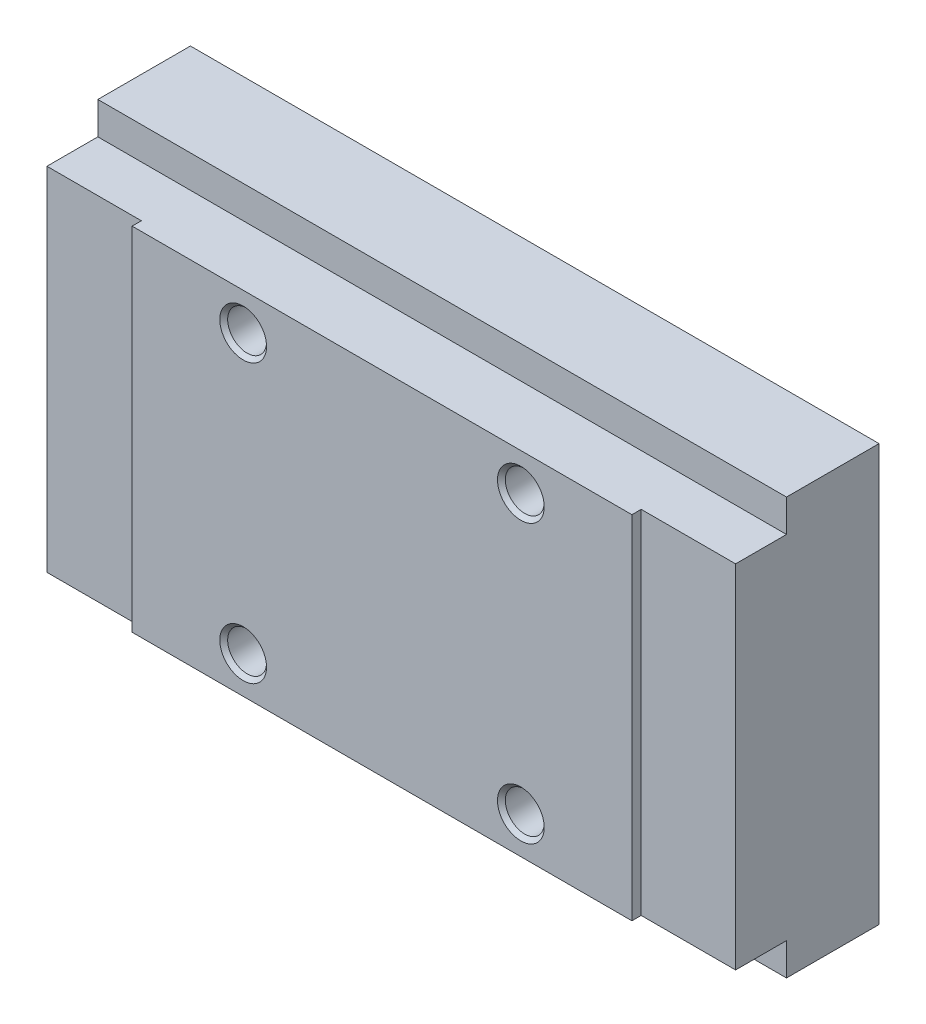
ISO-10303-21;
HEADER;
FILE_DESCRIPTION(('STEP AP214'),'2;1');
FILE_NAME('part.step','',(''),(''),'','','');
FILE_SCHEMA(('AUTOMOTIVE_DESIGN { 1 0 10303 214 1 1 1 1 }'));
ENDSEC;
DATA;
#1=APPLICATION_CONTEXT('core data for automotive mechanical design processes');
#2=APPLICATION_PROTOCOL_DEFINITION('international standard','automotive_design',2000,#1);
#3=PRODUCT_CONTEXT('',#1,'mechanical');
#4=PRODUCT('Part','Part','',(#3));
#5=PRODUCT_RELATED_PRODUCT_CATEGORY('part','',(#4));
#6=PRODUCT_DEFINITION_FORMATION('','',#4);
#7=PRODUCT_DEFINITION_CONTEXT('part definition',#1,'design');
#8=PRODUCT_DEFINITION('design','',#6,#7);
#9=PRODUCT_DEFINITION_SHAPE('','',#8);
#10=(LENGTH_UNIT() NAMED_UNIT(*) SI_UNIT(.MILLI.,.METRE.));
#11=(NAMED_UNIT(*) PLANE_ANGLE_UNIT() SI_UNIT($,.RADIAN.));
#12=(NAMED_UNIT(*) SI_UNIT($,.STERADIAN.) SOLID_ANGLE_UNIT());
#13=UNCERTAINTY_MEASURE_WITH_UNIT(LENGTH_MEASURE(1.E-05),#10,'distance_accuracy_value','');
#14=(GEOMETRIC_REPRESENTATION_CONTEXT(3) GLOBAL_UNCERTAINTY_ASSIGNED_CONTEXT((#13)) GLOBAL_UNIT_ASSIGNED_CONTEXT((#10,
#11,#12)) REPRESENTATION_CONTEXT('',''));
#15=CARTESIAN_POINT('',(0.,0.,0.));
#16=DIRECTION('',(0.,0.,1.));
#17=DIRECTION('',(1.,0.,0.));
#18=AXIS2_PLACEMENT_3D('',#15,#16,#17);
#19=CARTESIAN_POINT('',(0.,0.,10.));
#20=DIRECTION('',(1.,0.,0.));
#21=DIRECTION('',(0.,1.,0.));
#22=AXIS2_PLACEMENT_3D('',#19,#20,#21);
#23=PLANE('',#22);
#24=DIRECTION('',(0.,-1.,0.));
#25=VECTOR('',#24,1.);
#26=CARTESIAN_POINT('',(0.,0.,15.5));
#27=LINE('',#26,#25);
#28=CARTESIAN_POINT('',(0.,-3.5,15.5));
#29=VERTEX_POINT('',#28);
#30=CARTESIAN_POINT('',(0.,-41.5,15.5));
#31=VERTEX_POINT('',#30);
#32=EDGE_CURVE('E148',#29,#31,#27,.T.);
#33=ORIENTED_EDGE('',*,*,#32,.F.);
#34=DIRECTION('',(0.,0.,-1.));
#35=VECTOR('',#34,1.);
#36=CARTESIAN_POINT('',(0.,-3.5,16.5));
#37=LINE('',#36,#35);
#38=CARTESIAN_POINT('',(0.,-3.5,10.));
#39=VERTEX_POINT('',#38);
#40=EDGE_CURVE('E215',#29,#39,#37,.T.);
#41=ORIENTED_EDGE('',*,*,#40,.T.);
#42=DIRECTION('',(0.,-1.,0.));
#43=VECTOR('',#42,1.);
#44=CARTESIAN_POINT('',(0.,0.,10.));
#45=LINE('',#44,#43);
#46=CARTESIAN_POINT('',(0.,0.,10.));
#47=VERTEX_POINT('',#46);
#48=EDGE_CURVE('E228',#47,#39,#45,.T.);
#49=ORIENTED_EDGE('',*,*,#48,.F.);
#50=DIRECTION('',(0.,0.,-1.));
#51=VECTOR('',#50,1.);
#52=CARTESIAN_POINT('',(0.,0.,10.));
#53=LINE('',#52,#51);
#54=CARTESIAN_POINT('',(0.,0.,0.));
#55=VERTEX_POINT('',#54);
#56=EDGE_CURVE('E240',#47,#55,#53,.T.);
#57=ORIENTED_EDGE('',*,*,#56,.T.);
#58=DIRECTION('',(0.,-1.,0.));
#59=VECTOR('',#58,1.);
#60=CARTESIAN_POINT('',(0.,0.,0.));
#61=LINE('',#60,#59);
#62=CARTESIAN_POINT('',(0.,-45.,0.));
#63=VERTEX_POINT('',#62);
#64=EDGE_CURVE('E227',#55,#63,#61,.T.);
#65=ORIENTED_EDGE('',*,*,#64,.T.);
#66=DIRECTION('',(0.,0.,-1.));
#67=VECTOR('',#66,1.);
#68=CARTESIAN_POINT('',(0.,-45.,10.));
#69=LINE('',#68,#67);
#70=CARTESIAN_POINT('',(0.,-45.,10.));
#71=VERTEX_POINT('',#70);
#72=EDGE_CURVE('E256',#71,#63,#69,.T.);
#73=ORIENTED_EDGE('',*,*,#72,.F.);
#74=CARTESIAN_POINT('',(0.,-41.5,10.));
#75=VERTEX_POINT('',#74);
#76=EDGE_CURVE('E232',#75,#71,#45,.T.);
#77=ORIENTED_EDGE('',*,*,#76,.F.);
#78=DIRECTION('',(0.,0.,-1.));
#79=VECTOR('',#78,1.);
#80=CARTESIAN_POINT('',(0.,-41.5,16.5));
#81=LINE('',#80,#79);
#82=EDGE_CURVE('E225',#31,#75,#81,.T.);
#83=ORIENTED_EDGE('',*,*,#82,.F.);
#84=EDGE_LOOP('',(#33,#41,#49,#57,#65,#73,#77,#83));
#85=FACE_BOUND('',#84,.T.);
#86=ADVANCED_FACE('F42',(#85),#23,.F.);
#87=CARTESIAN_POINT('',(74.4,0.,10.));
#88=DIRECTION('',(-1.,0.,0.));
#89=DIRECTION('',(0.,0.,1.));
#90=AXIS2_PLACEMENT_3D('',#87,#88,#89);
#91=PLANE('',#90);
#92=DIRECTION('',(0.,1.,0.));
#93=VECTOR('',#92,1.);
#94=CARTESIAN_POINT('',(74.4,0.,15.5));
#95=LINE('',#94,#93);
#96=CARTESIAN_POINT('',(74.4,-41.5,15.5));
#97=VERTEX_POINT('',#96);
#98=CARTESIAN_POINT('',(74.4,-3.5,15.5));
#99=VERTEX_POINT('',#98);
#100=EDGE_CURVE('E151',#97,#99,#95,.T.);
#101=ORIENTED_EDGE('',*,*,#100,.F.);
#102=DIRECTION('',(0.,0.,-1.));
#103=VECTOR('',#102,1.);
#104=CARTESIAN_POINT('',(74.4,-41.5,16.5));
#105=LINE('',#104,#103);
#106=CARTESIAN_POINT('',(74.4,-41.5,10.));
#107=VERTEX_POINT('',#106);
#108=EDGE_CURVE('E223',#97,#107,#105,.T.);
#109=ORIENTED_EDGE('',*,*,#108,.T.);
#110=DIRECTION('',(0.,1.,0.));
#111=VECTOR('',#110,1.);
#112=CARTESIAN_POINT('',(74.4,0.,10.));
#113=LINE('',#112,#111);
#114=CARTESIAN_POINT('',(74.4,-45.,10.));
#115=VERTEX_POINT('',#114);
#116=EDGE_CURVE('E235',#115,#107,#113,.T.);
#117=ORIENTED_EDGE('',*,*,#116,.F.);
#118=DIRECTION('',(0.,0.,-1.));
#119=VECTOR('',#118,1.);
#120=CARTESIAN_POINT('',(74.4,-45.,10.));
#121=LINE('',#120,#119);
#122=CARTESIAN_POINT('',(74.4,-45.,0.));
#123=VERTEX_POINT('',#122);
#124=EDGE_CURVE('E254',#115,#123,#121,.T.);
#125=ORIENTED_EDGE('',*,*,#124,.T.);
#126=DIRECTION('',(0.,1.,0.));
#127=VECTOR('',#126,1.);
#128=CARTESIAN_POINT('',(74.4,0.,0.));
#129=LINE('',#128,#127);
#130=CARTESIAN_POINT('',(74.4,0.,0.));
#131=VERTEX_POINT('',#130);
#132=EDGE_CURVE('E245',#123,#131,#129,.T.);
#133=ORIENTED_EDGE('',*,*,#132,.T.);
#134=DIRECTION('',(0.,0.,-1.));
#135=VECTOR('',#134,1.);
#136=CARTESIAN_POINT('',(74.4,0.,10.));
#137=LINE('',#136,#135);
#138=CARTESIAN_POINT('',(74.4,0.,10.));
#139=VERTEX_POINT('',#138);
#140=EDGE_CURVE('E251',#139,#131,#137,.T.);
#141=ORIENTED_EDGE('',*,*,#140,.F.);
#142=CARTESIAN_POINT('',(74.4,-3.5,10.));
#143=VERTEX_POINT('',#142);
#144=EDGE_CURVE('E234',#143,#139,#113,.T.);
#145=ORIENTED_EDGE('',*,*,#144,.F.);
#146=DIRECTION('',(0.,0.,-1.));
#147=VECTOR('',#146,1.);
#148=CARTESIAN_POINT('',(74.4,-3.5,16.5));
#149=LINE('',#148,#147);
#150=EDGE_CURVE('E221',#99,#143,#149,.T.);
#151=ORIENTED_EDGE('',*,*,#150,.F.);
#152=EDGE_LOOP('',(#101,#109,#117,#125,#133,#141,#145,#151));
#153=FACE_BOUND('',#152,.T.);
#154=ADVANCED_FACE('F276',(#153),#91,.F.);
#155=CARTESIAN_POINT('',(0.,-41.5,16.5));
#156=DIRECTION('',(0.,1.,0.));
#157=DIRECTION('',(0.,0.,1.));
#158=AXIS2_PLACEMENT_3D('',#155,#156,#157);
#159=PLANE('',#158);
#160=DIRECTION('',(0.,0.,1.));
#161=VECTOR('',#160,1.);
#162=CARTESIAN_POINT('',(10.2,-41.5,15.5));
#163=LINE('',#162,#161);
#164=CARTESIAN_POINT('',(10.2,-41.5,15.5));
#165=VERTEX_POINT('',#164);
#166=CARTESIAN_POINT('',(10.2,-41.5,16.5));
#167=VERTEX_POINT('',#166);
#168=EDGE_CURVE('E64',#165,#167,#163,.T.);
#169=ORIENTED_EDGE('',*,*,#168,.F.);
#170=DIRECTION('',(1.,0.,0.));
#171=VECTOR('',#170,1.);
#172=CARTESIAN_POINT('',(0.,-41.5,15.5));
#173=LINE('',#172,#171);
#174=EDGE_CURVE('E143',#31,#165,#173,.T.);
#175=ORIENTED_EDGE('',*,*,#174,.F.);
#176=ORIENTED_EDGE('',*,*,#82,.T.);
#177=DIRECTION('',(1.,0.,0.));
#178=VECTOR('',#177,1.);
#179=CARTESIAN_POINT('',(0.,-41.5,10.));
#180=LINE('',#179,#178);
#181=EDGE_CURVE('E209',#75,#107,#180,.T.);
#182=ORIENTED_EDGE('',*,*,#181,.T.);
#183=ORIENTED_EDGE('',*,*,#108,.F.);
#184=CARTESIAN_POINT('',(64.2,-41.5,15.5));
#185=VERTEX_POINT('',#184);
#186=EDGE_CURVE('E153',#185,#97,#173,.T.);
#187=ORIENTED_EDGE('',*,*,#186,.F.);
#188=DIRECTION('',(0.,0.,1.));
#189=VECTOR('',#188,1.);
#190=CARTESIAN_POINT('',(64.2,-41.5,15.5));
#191=LINE('',#190,#189);
#192=CARTESIAN_POINT('',(64.2,-41.5,16.5));
#193=VERTEX_POINT('',#192);
#194=EDGE_CURVE('E165',#185,#193,#191,.T.);
#195=ORIENTED_EDGE('',*,*,#194,.T.);
#196=DIRECTION('',(1.,0.,0.));
#197=VECTOR('',#196,1.);
#198=CARTESIAN_POINT('',(0.,-41.5,16.5));
#199=LINE('',#198,#197);
#200=EDGE_CURVE('E164',#167,#193,#199,.T.);
#201=ORIENTED_EDGE('',*,*,#200,.F.);
#202=EDGE_LOOP('',(#169,#175,#176,#182,#183,#187,#195,#201));
#203=FACE_BOUND('',#202,.T.);
#204=ADVANCED_FACE('F161',(#203),#159,.F.);
#205=CARTESIAN_POINT('',(0.,-3.5,16.5));
#206=DIRECTION('',(0.,-1.,0.));
#207=DIRECTION('',(0.,0.,-1.));
#208=AXIS2_PLACEMENT_3D('',#205,#206,#207);
#209=PLANE('',#208);
#210=DIRECTION('',(0.,0.,1.));
#211=VECTOR('',#210,1.);
#212=CARTESIAN_POINT('',(10.2,-3.5,15.5));
#213=LINE('',#212,#211);
#214=CARTESIAN_POINT('',(10.2,-3.5,15.5));
#215=VERTEX_POINT('',#214);
#216=CARTESIAN_POINT('',(10.2,-3.5,16.5));
#217=VERTEX_POINT('',#216);
#218=EDGE_CURVE('E156',#215,#217,#213,.T.);
#219=ORIENTED_EDGE('',*,*,#218,.T.);
#220=DIRECTION('',(-1.,0.,0.));
#221=VECTOR('',#220,1.);
#222=CARTESIAN_POINT('',(0.,-3.5,16.5));
#223=LINE('',#222,#221);
#224=CARTESIAN_POINT('',(64.2,-3.5,16.5));
#225=VERTEX_POINT('',#224);
#226=EDGE_CURVE('E211',#225,#217,#223,.T.);
#227=ORIENTED_EDGE('',*,*,#226,.F.);
#228=DIRECTION('',(0.,0.,1.));
#229=VECTOR('',#228,1.);
#230=CARTESIAN_POINT('',(64.2,-3.5,15.5));
#231=LINE('',#230,#229);
#232=CARTESIAN_POINT('',(64.2,-3.5,15.5));
#233=VERTEX_POINT('',#232);
#234=EDGE_CURVE('E56',#233,#225,#231,.T.);
#235=ORIENTED_EDGE('',*,*,#234,.F.);
#236=DIRECTION('',(-1.,0.,0.));
#237=VECTOR('',#236,1.);
#238=CARTESIAN_POINT('',(0.,-3.5,15.5));
#239=LINE('',#238,#237);
#240=EDGE_CURVE('E12',#99,#233,#239,.T.);
#241=ORIENTED_EDGE('',*,*,#240,.F.);
#242=ORIENTED_EDGE('',*,*,#150,.T.);
#243=DIRECTION('',(-1.,0.,0.));
#244=VECTOR('',#243,1.);
#245=CARTESIAN_POINT('',(0.,-3.5,10.));
#246=LINE('',#245,#244);
#247=EDGE_CURVE('E212',#143,#39,#246,.T.);
#248=ORIENTED_EDGE('',*,*,#247,.T.);
#249=ORIENTED_EDGE('',*,*,#40,.F.);
#250=EDGE_CURVE('E49',#215,#29,#239,.T.);
#251=ORIENTED_EDGE('',*,*,#250,.F.);
#252=EDGE_LOOP('',(#219,#227,#235,#241,#242,#248,#249,#251));
#253=FACE_BOUND('',#252,.T.);
#254=ADVANCED_FACE('F266',(#253),#209,.F.);
#255=CARTESIAN_POINT('',(0.,0.,16.5));
#256=DIRECTION('',(0.,0.,1.));
#257=DIRECTION('',(1.,0.,0.));
#258=AXIS2_PLACEMENT_3D('',#255,#256,#257);
#259=PLANE('',#258);
#260=CARTESIAN_POINT('',(22.2,-7.5,16.5));
#261=DIRECTION('',(0.,0.,1.));
#262=DIRECTION('',(1.,0.,0.));
#263=AXIS2_PLACEMENT_3D('',#260,#261,#262);
#264=CIRCLE('',#263,2.525);
#265=CARTESIAN_POINT('',(24.725,-7.5,16.5));
#266=VERTEX_POINT('',#265);
#267=EDGE_CURVE('E173',#266,#266,#264,.T.);
#268=ORIENTED_EDGE('',*,*,#267,.F.);
#269=EDGE_LOOP('',(#268));
#270=FACE_BOUND('',#269,.T.);
#271=CARTESIAN_POINT('',(52.2,-7.5,16.5));
#272=DIRECTION('',(0.,0.,1.));
#273=DIRECTION('',(1.,0.,0.));
#274=AXIS2_PLACEMENT_3D('',#271,#272,#273);
#275=CIRCLE('',#274,2.525);
#276=CARTESIAN_POINT('',(54.725,-7.5,16.5));
#277=VERTEX_POINT('',#276);
#278=EDGE_CURVE('E182',#277,#277,#275,.T.);
#279=ORIENTED_EDGE('',*,*,#278,.F.);
#280=EDGE_LOOP('',(#279));
#281=FACE_BOUND('',#280,.T.);
#282=CARTESIAN_POINT('',(52.2000000000003,-37.5,16.5));
#283=DIRECTION('',(0.,0.,1.));
#284=DIRECTION('',(1.,0.,0.));
#285=AXIS2_PLACEMENT_3D('',#282,#283,#284);
#286=CIRCLE('',#285,2.525);
#287=CARTESIAN_POINT('',(54.7250000000003,-37.5,16.5));
#288=VERTEX_POINT('',#287);
#289=EDGE_CURVE('E191',#288,#288,#286,.T.);
#290=ORIENTED_EDGE('',*,*,#289,.F.);
#291=EDGE_LOOP('',(#290));
#292=FACE_BOUND('',#291,.T.);
#293=CARTESIAN_POINT('',(22.2000000000003,-37.5,16.5));
#294=DIRECTION('',(0.,0.,1.));
#295=DIRECTION('',(1.,0.,0.));
#296=AXIS2_PLACEMENT_3D('',#293,#294,#295);
#297=CIRCLE('',#296,2.525);
#298=CARTESIAN_POINT('',(24.7250000000003,-37.5,16.5));
#299=VERTEX_POINT('',#298);
#300=EDGE_CURVE('E200',#299,#299,#297,.T.);
#301=ORIENTED_EDGE('',*,*,#300,.F.);
#302=EDGE_LOOP('',(#301));
#303=FACE_BOUND('',#302,.T.);
#304=ORIENTED_EDGE('',*,*,#226,.T.);
#305=DIRECTION('',(0.,-1.,0.));
#306=VECTOR('',#305,1.);
#307=CARTESIAN_POINT('',(10.2,-3.5,16.5));
#308=LINE('',#307,#306);
#309=EDGE_CURVE('E300',#217,#167,#308,.T.);
#310=ORIENTED_EDGE('',*,*,#309,.T.);
#311=ORIENTED_EDGE('',*,*,#200,.T.);
#312=DIRECTION('',(0.,1.,0.));
#313=VECTOR('',#312,1.);
#314=CARTESIAN_POINT('',(64.2,-3.5,16.5));
#315=LINE('',#314,#313);
#316=EDGE_CURVE('E158',#193,#225,#315,.T.);
#317=ORIENTED_EDGE('',*,*,#316,.T.);
#318=EDGE_LOOP('',(#304,#310,#311,#317));
#319=FACE_BOUND('',#318,.T.);
#320=ADVANCED_FACE('F304',(#270,#281,#292,#303,#319),#259,.T.);
#321=CARTESIAN_POINT('',(0.,0.,10.));
#322=DIRECTION('',(0.,0.,1.));
#323=DIRECTION('',(1.,0.,0.));
#324=AXIS2_PLACEMENT_3D('',#321,#322,#323);
#325=PLANE('',#324);
#326=ORIENTED_EDGE('',*,*,#247,.F.);
#327=ORIENTED_EDGE('',*,*,#144,.T.);
#328=DIRECTION('',(-1.,0.,0.));
#329=VECTOR('',#328,1.);
#330=CARTESIAN_POINT('',(0.,0.,10.));
#331=LINE('',#330,#329);
#332=EDGE_CURVE('E238',#139,#47,#331,.T.);
#333=ORIENTED_EDGE('',*,*,#332,.T.);
#334=ORIENTED_EDGE('',*,*,#48,.T.);
#335=EDGE_LOOP('',(#326,#327,#333,#334));
#336=FACE_BOUND('',#335,.T.);
#337=ADVANCED_FACE('F272',(#336),#325,.T.);
#338=CARTESIAN_POINT('',(0.,-45.,10.));
#339=DIRECTION('',(0.,1.,0.));
#340=DIRECTION('',(0.,0.,1.));
#341=AXIS2_PLACEMENT_3D('',#338,#339,#340);
#342=PLANE('',#341);
#343=DIRECTION('',(1.,0.,0.));
#344=VECTOR('',#343,1.);
#345=CARTESIAN_POINT('',(0.,-45.,0.));
#346=LINE('',#345,#344);
#347=EDGE_CURVE('E243',#63,#123,#346,.T.);
#348=ORIENTED_EDGE('',*,*,#347,.T.);
#349=ORIENTED_EDGE('',*,*,#124,.F.);
#350=DIRECTION('',(1.,0.,0.));
#351=VECTOR('',#350,1.);
#352=CARTESIAN_POINT('',(0.,-45.,10.));
#353=LINE('',#352,#351);
#354=EDGE_CURVE('E231',#71,#115,#353,.T.);
#355=ORIENTED_EDGE('',*,*,#354,.F.);
#356=ORIENTED_EDGE('',*,*,#72,.T.);
#357=EDGE_LOOP('',(#348,#349,#355,#356));
#358=FACE_BOUND('',#357,.T.);
#359=ADVANCED_FACE('F287',(#358),#342,.F.);
#360=CARTESIAN_POINT('',(0.,0.,10.));
#361=DIRECTION('',(0.,-1.,0.));
#362=DIRECTION('',(0.,0.,-1.));
#363=AXIS2_PLACEMENT_3D('',#360,#361,#362);
#364=PLANE('',#363);
#365=DIRECTION('',(-1.,0.,0.));
#366=VECTOR('',#365,1.);
#367=CARTESIAN_POINT('',(0.,0.,0.));
#368=LINE('',#367,#366);
#369=EDGE_CURVE('E247',#131,#55,#368,.T.);
#370=ORIENTED_EDGE('',*,*,#369,.T.);
#371=ORIENTED_EDGE('',*,*,#56,.F.);
#372=ORIENTED_EDGE('',*,*,#332,.F.);
#373=ORIENTED_EDGE('',*,*,#140,.T.);
#374=EDGE_LOOP('',(#370,#371,#372,#373));
#375=FACE_BOUND('',#374,.T.);
#376=ADVANCED_FACE('F282',(#375),#364,.F.);
#377=ORIENTED_EDGE('',*,*,#181,.F.);
#378=ORIENTED_EDGE('',*,*,#76,.T.);
#379=ORIENTED_EDGE('',*,*,#354,.T.);
#380=ORIENTED_EDGE('',*,*,#116,.T.);
#381=EDGE_LOOP('',(#377,#378,#379,#380));
#382=FACE_BOUND('',#381,.T.);
#383=ADVANCED_FACE('F292',(#382),#325,.T.);
#384=CARTESIAN_POINT('',(0.,0.,0.));
#385=DIRECTION('',(0.,0.,1.));
#386=DIRECTION('',(1.,0.,0.));
#387=AXIS2_PLACEMENT_3D('',#384,#385,#386);
#388=PLANE('',#387);
#389=ORIENTED_EDGE('',*,*,#64,.F.);
#390=ORIENTED_EDGE('',*,*,#369,.F.);
#391=ORIENTED_EDGE('',*,*,#132,.F.);
#392=ORIENTED_EDGE('',*,*,#347,.F.);
#393=EDGE_LOOP('',(#389,#390,#391,#392));
#394=FACE_BOUND('',#393,.T.);
#395=ADVANCED_FACE('F285',(#394),#388,.F.);
#396=CARTESIAN_POINT('',(22.2000000000003,-37.5,4.1));
#397=DIRECTION('',(0.,0.,1.));
#398=DIRECTION('',(1.,0.,0.));
#399=AXIS2_PLACEMENT_3D('',#396,#397,#398);
#400=CONICAL_SURFACE('',#399,2.1,1.02974425867665);
#401=CARTESIAN_POINT('',(22.2000000000003,-37.5,2.83819270004212));
#402=VERTEX_POINT('',#401);
#403=VERTEX_LOOP('',#402);
#404=FACE_BOUND('',#403,.T.);
#405=CARTESIAN_POINT('',(22.2000000000003,-37.5,4.1));
#406=DIRECTION('',(0.,0.,1.));
#407=DIRECTION('',(1.,0.,0.));
#408=AXIS2_PLACEMENT_3D('',#405,#406,#407);
#409=CIRCLE('',#408,2.1);
#410=CARTESIAN_POINT('',(24.3000000000003,-37.5,4.1));
#411=VERTEX_POINT('',#410);
#412=EDGE_CURVE('E206',#411,#411,#409,.T.);
#413=ORIENTED_EDGE('',*,*,#412,.T.);
#414=EDGE_LOOP('',(#413));
#415=FACE_BOUND('',#414,.T.);
#416=ADVANCED_FACE('F338',(#404,#415),#400,.F.);
#417=CARTESIAN_POINT('',(22.2000000000003,-37.5,16.5));
#418=DIRECTION('',(0.,0.,1.));
#419=DIRECTION('',(1.,0.,0.));
#420=AXIS2_PLACEMENT_3D('',#417,#418,#419);
#421=CYLINDRICAL_SURFACE('',#420,2.1);
#422=ORIENTED_EDGE('',*,*,#412,.F.);
#423=EDGE_LOOP('',(#422));
#424=FACE_BOUND('',#423,.T.);
#425=CARTESIAN_POINT('',(22.2000000000003,-37.5,16.075));
#426=DIRECTION('',(0.,0.,1.));
#427=DIRECTION('',(1.,0.,0.));
#428=AXIS2_PLACEMENT_3D('',#425,#426,#427);
#429=CIRCLE('',#428,2.1);
#430=CARTESIAN_POINT('',(24.3000000000003,-37.5,16.075));
#431=VERTEX_POINT('',#430);
#432=EDGE_CURVE('E203',#431,#431,#429,.T.);
#433=ORIENTED_EDGE('',*,*,#432,.T.);
#434=EDGE_LOOP('',(#433));
#435=FACE_BOUND('',#434,.T.);
#436=ADVANCED_FACE('F342',(#424,#435),#421,.F.);
#437=CARTESIAN_POINT('',(22.2000000000003,-37.5,16.5));
#438=DIRECTION('',(0.,0.,1.));
#439=DIRECTION('',(1.,0.,0.));
#440=AXIS2_PLACEMENT_3D('',#437,#438,#439);
#441=CONICAL_SURFACE('',#440,2.525,0.785398163397448);
#442=ORIENTED_EDGE('',*,*,#432,.F.);
#443=EDGE_LOOP('',(#442));
#444=FACE_BOUND('',#443,.T.);
#445=ORIENTED_EDGE('',*,*,#300,.T.);
#446=EDGE_LOOP('',(#445));
#447=FACE_BOUND('',#446,.T.);
#448=ADVANCED_FACE('F347',(#444,#447),#441,.F.);
#449=CARTESIAN_POINT('',(52.2000000000003,-37.5,4.1));
#450=DIRECTION('',(0.,0.,1.));
#451=DIRECTION('',(1.,0.,0.));
#452=AXIS2_PLACEMENT_3D('',#449,#450,#451);
#453=CONICAL_SURFACE('',#452,2.1,1.02974425867665);
#454=CARTESIAN_POINT('',(52.2000000000003,-37.5,2.83819270004212));
#455=VERTEX_POINT('',#454);
#456=VERTEX_LOOP('',#455);
#457=FACE_BOUND('',#456,.T.);
#458=CARTESIAN_POINT('',(52.2000000000003,-37.5,4.1));
#459=DIRECTION('',(0.,0.,1.));
#460=DIRECTION('',(1.,0.,0.));
#461=AXIS2_PLACEMENT_3D('',#458,#459,#460);
#462=CIRCLE('',#461,2.1);
#463=CARTESIAN_POINT('',(54.3000000000003,-37.5,4.1));
#464=VERTEX_POINT('',#463);
#465=EDGE_CURVE('E197',#464,#464,#462,.T.);
#466=ORIENTED_EDGE('',*,*,#465,.T.);
#467=EDGE_LOOP('',(#466));
#468=FACE_BOUND('',#467,.T.);
#469=ADVANCED_FACE('F354',(#457,#468),#453,.F.);
#470=CARTESIAN_POINT('',(52.2000000000003,-37.5,16.5));
#471=DIRECTION('',(0.,0.,1.));
#472=DIRECTION('',(1.,0.,0.));
#473=AXIS2_PLACEMENT_3D('',#470,#471,#472);
#474=CYLINDRICAL_SURFACE('',#473,2.1);
#475=ORIENTED_EDGE('',*,*,#465,.F.);
#476=EDGE_LOOP('',(#475));
#477=FACE_BOUND('',#476,.T.);
#478=CARTESIAN_POINT('',(52.2000000000003,-37.5,16.075));
#479=DIRECTION('',(0.,0.,1.));
#480=DIRECTION('',(1.,0.,0.));
#481=AXIS2_PLACEMENT_3D('',#478,#479,#480);
#482=CIRCLE('',#481,2.1);
#483=CARTESIAN_POINT('',(54.3000000000003,-37.5,16.075));
#484=VERTEX_POINT('',#483);
#485=EDGE_CURVE('E194',#484,#484,#482,.T.);
#486=ORIENTED_EDGE('',*,*,#485,.T.);
#487=EDGE_LOOP('',(#486));
#488=FACE_BOUND('',#487,.T.);
#489=ADVANCED_FACE('F358',(#477,#488),#474,.F.);
#490=CARTESIAN_POINT('',(52.2000000000003,-37.5,16.5));
#491=DIRECTION('',(0.,0.,1.));
#492=DIRECTION('',(1.,0.,0.));
#493=AXIS2_PLACEMENT_3D('',#490,#491,#492);
#494=CONICAL_SURFACE('',#493,2.525,0.785398163397448);
#495=ORIENTED_EDGE('',*,*,#485,.F.);
#496=EDGE_LOOP('',(#495));
#497=FACE_BOUND('',#496,.T.);
#498=ORIENTED_EDGE('',*,*,#289,.T.);
#499=EDGE_LOOP('',(#498));
#500=FACE_BOUND('',#499,.T.);
#501=ADVANCED_FACE('F362',(#497,#500),#494,.F.);
#502=CARTESIAN_POINT('',(52.2,-7.5,4.1));
#503=DIRECTION('',(0.,0.,1.));
#504=DIRECTION('',(1.,0.,0.));
#505=AXIS2_PLACEMENT_3D('',#502,#503,#504);
#506=CONICAL_SURFACE('',#505,2.1,1.02974425867665);
#507=CARTESIAN_POINT('',(52.2,-7.5,2.83819270004212));
#508=VERTEX_POINT('',#507);
#509=VERTEX_LOOP('',#508);
#510=FACE_BOUND('',#509,.T.);
#511=CARTESIAN_POINT('',(52.2,-7.5,4.1));
#512=DIRECTION('',(0.,0.,1.));
#513=DIRECTION('',(1.,0.,0.));
#514=AXIS2_PLACEMENT_3D('',#511,#512,#513);
#515=CIRCLE('',#514,2.1);
#516=CARTESIAN_POINT('',(54.3,-7.5,4.1));
#517=VERTEX_POINT('',#516);
#518=EDGE_CURVE('E188',#517,#517,#515,.T.);
#519=ORIENTED_EDGE('',*,*,#518,.T.);
#520=EDGE_LOOP('',(#519));
#521=FACE_BOUND('',#520,.T.);
#522=ADVANCED_FACE('F366',(#510,#521),#506,.F.);
#523=CARTESIAN_POINT('',(52.2,-7.5,16.5));
#524=DIRECTION('',(0.,0.,1.));
#525=DIRECTION('',(1.,0.,0.));
#526=AXIS2_PLACEMENT_3D('',#523,#524,#525);
#527=CYLINDRICAL_SURFACE('',#526,2.1);
#528=ORIENTED_EDGE('',*,*,#518,.F.);
#529=EDGE_LOOP('',(#528));
#530=FACE_BOUND('',#529,.T.);
#531=CARTESIAN_POINT('',(52.2,-7.5,16.075));
#532=DIRECTION('',(0.,0.,1.));
#533=DIRECTION('',(1.,0.,0.));
#534=AXIS2_PLACEMENT_3D('',#531,#532,#533);
#535=CIRCLE('',#534,2.1);
#536=CARTESIAN_POINT('',(54.3,-7.5,16.075));
#537=VERTEX_POINT('',#536);
#538=EDGE_CURVE('E185',#537,#537,#535,.T.);
#539=ORIENTED_EDGE('',*,*,#538,.T.);
#540=EDGE_LOOP('',(#539));
#541=FACE_BOUND('',#540,.T.);
#542=ADVANCED_FACE('F370',(#530,#541),#527,.F.);
#543=CARTESIAN_POINT('',(52.2,-7.5,16.5));
#544=DIRECTION('',(0.,0.,1.));
#545=DIRECTION('',(1.,0.,0.));
#546=AXIS2_PLACEMENT_3D('',#543,#544,#545);
#547=CONICAL_SURFACE('',#546,2.525,0.785398163397448);
#548=ORIENTED_EDGE('',*,*,#538,.F.);
#549=EDGE_LOOP('',(#548));
#550=FACE_BOUND('',#549,.T.);
#551=ORIENTED_EDGE('',*,*,#278,.T.);
#552=EDGE_LOOP('',(#551));
#553=FACE_BOUND('',#552,.T.);
#554=ADVANCED_FACE('F374',(#550,#553),#547,.F.);
#555=CARTESIAN_POINT('',(22.2,-7.5,4.1));
#556=DIRECTION('',(0.,0.,1.));
#557=DIRECTION('',(1.,0.,0.));
#558=AXIS2_PLACEMENT_3D('',#555,#556,#557);
#559=CONICAL_SURFACE('',#558,2.1,1.02974425867665);
#560=CARTESIAN_POINT('',(22.2,-7.5,2.83819270004212));
#561=VERTEX_POINT('',#560);
#562=VERTEX_LOOP('',#561);
#563=FACE_BOUND('',#562,.T.);
#564=CARTESIAN_POINT('',(22.2,-7.5,4.1));
#565=DIRECTION('',(0.,0.,1.));
#566=DIRECTION('',(1.,0.,0.));
#567=AXIS2_PLACEMENT_3D('',#564,#565,#566);
#568=CIRCLE('',#567,2.1);
#569=CARTESIAN_POINT('',(24.3,-7.5,4.1));
#570=VERTEX_POINT('',#569);
#571=EDGE_CURVE('E179',#570,#570,#568,.T.);
#572=ORIENTED_EDGE('',*,*,#571,.T.);
#573=EDGE_LOOP('',(#572));
#574=FACE_BOUND('',#573,.T.);
#575=ADVANCED_FACE('F378',(#563,#574),#559,.F.);
#576=CARTESIAN_POINT('',(22.2,-7.5,16.5));
#577=DIRECTION('',(0.,0.,1.));
#578=DIRECTION('',(1.,0.,0.));
#579=AXIS2_PLACEMENT_3D('',#576,#577,#578);
#580=CYLINDRICAL_SURFACE('',#579,2.1);
#581=ORIENTED_EDGE('',*,*,#571,.F.);
#582=EDGE_LOOP('',(#581));
#583=FACE_BOUND('',#582,.T.);
#584=CARTESIAN_POINT('',(22.2,-7.5,16.075));
#585=DIRECTION('',(0.,0.,1.));
#586=DIRECTION('',(1.,0.,0.));
#587=AXIS2_PLACEMENT_3D('',#584,#585,#586);
#588=CIRCLE('',#587,2.1);
#589=CARTESIAN_POINT('',(24.3,-7.5,16.075));
#590=VERTEX_POINT('',#589);
#591=EDGE_CURVE('E176',#590,#590,#588,.T.);
#592=ORIENTED_EDGE('',*,*,#591,.T.);
#593=EDGE_LOOP('',(#592));
#594=FACE_BOUND('',#593,.T.);
#595=ADVANCED_FACE('F382',(#583,#594),#580,.F.);
#596=CARTESIAN_POINT('',(22.2,-7.5,16.5));
#597=DIRECTION('',(0.,0.,1.));
#598=DIRECTION('',(1.,0.,0.));
#599=AXIS2_PLACEMENT_3D('',#596,#597,#598);
#600=CONICAL_SURFACE('',#599,2.525,0.785398163397448);
#601=ORIENTED_EDGE('',*,*,#591,.F.);
#602=EDGE_LOOP('',(#601));
#603=FACE_BOUND('',#602,.T.);
#604=ORIENTED_EDGE('',*,*,#267,.T.);
#605=EDGE_LOOP('',(#604));
#606=FACE_BOUND('',#605,.T.);
#607=ADVANCED_FACE('F386',(#603,#606),#600,.F.);
#608=CARTESIAN_POINT('',(64.2,-3.5,15.5));
#609=DIRECTION('',(1.,0.,0.));
#610=DIRECTION('',(0.,0.,-1.));
#611=AXIS2_PLACEMENT_3D('',#608,#609,#610);
#612=PLANE('',#611);
#613=ORIENTED_EDGE('',*,*,#316,.F.);
#614=ORIENTED_EDGE('',*,*,#194,.F.);
#615=DIRECTION('',(0.,1.,0.));
#616=VECTOR('',#615,1.);
#617=CARTESIAN_POINT('',(64.2,-3.5,15.5));
#618=LINE('',#617,#616);
#619=EDGE_CURVE('E157',#185,#233,#618,.T.);
#620=ORIENTED_EDGE('',*,*,#619,.T.);
#621=ORIENTED_EDGE('',*,*,#234,.T.);
#622=EDGE_LOOP('',(#613,#614,#620,#621));
#623=FACE_BOUND('',#622,.T.);
#624=ADVANCED_FACE('F297',(#623),#612,.T.);
#625=CARTESIAN_POINT('',(37.2,-22.5,15.5));
#626=DIRECTION('',(0.,0.,1.));
#627=DIRECTION('',(1.,0.,0.));
#628=AXIS2_PLACEMENT_3D('',#625,#626,#627);
#629=PLANE('',#628);
#630=ORIENTED_EDGE('',*,*,#186,.T.);
#631=ORIENTED_EDGE('',*,*,#100,.T.);
#632=ORIENTED_EDGE('',*,*,#240,.T.);
#633=ORIENTED_EDGE('',*,*,#619,.F.);
#634=EDGE_LOOP('',(#630,#631,#632,#633));
#635=FACE_BOUND('',#634,.T.);
#636=ADVANCED_FACE('F296',(#635),#629,.T.);
#637=ORIENTED_EDGE('',*,*,#174,.T.);
#638=DIRECTION('',(0.,-1.,0.));
#639=VECTOR('',#638,1.);
#640=CARTESIAN_POINT('',(10.2,-3.5,15.5));
#641=LINE('',#640,#639);
#642=EDGE_CURVE('E145',#215,#165,#641,.T.);
#643=ORIENTED_EDGE('',*,*,#642,.F.);
#644=ORIENTED_EDGE('',*,*,#250,.T.);
#645=ORIENTED_EDGE('',*,*,#32,.T.);
#646=EDGE_LOOP('',(#637,#643,#644,#645));
#647=FACE_BOUND('',#646,.T.);
#648=ADVANCED_FACE('F144',(#647),#629,.T.);
#649=CARTESIAN_POINT('',(10.2,-3.5,15.5));
#650=DIRECTION('',(-1.,0.,0.));
#651=DIRECTION('',(0.,-1.,0.));
#652=AXIS2_PLACEMENT_3D('',#649,#650,#651);
#653=PLANE('',#652);
#654=ORIENTED_EDGE('',*,*,#309,.F.);
#655=ORIENTED_EDGE('',*,*,#218,.F.);
#656=ORIENTED_EDGE('',*,*,#642,.T.);
#657=ORIENTED_EDGE('',*,*,#168,.T.);
#658=EDGE_LOOP('',(#654,#655,#656,#657));
#659=FACE_BOUND('',#658,.T.);
#660=ADVANCED_FACE('F154',(#659),#653,.T.);
#661=CLOSED_SHELL('',(#86,#154,#204,#254,#320,#337,#359,#376,#383,#395,#416,#436,#448,#469,#489,
#501,#522,#542,#554,#575,#595,#607,#624,#636,#648,#660));
#662=MANIFOLD_SOLID_BREP('B2',#661);
#663=ADVANCED_BREP_SHAPE_REPRESENTATION('',(#18,#662),#14);
#664=SHAPE_DEFINITION_REPRESENTATION(#9,#663);
ENDSEC;
END-ISO-10303-21;
